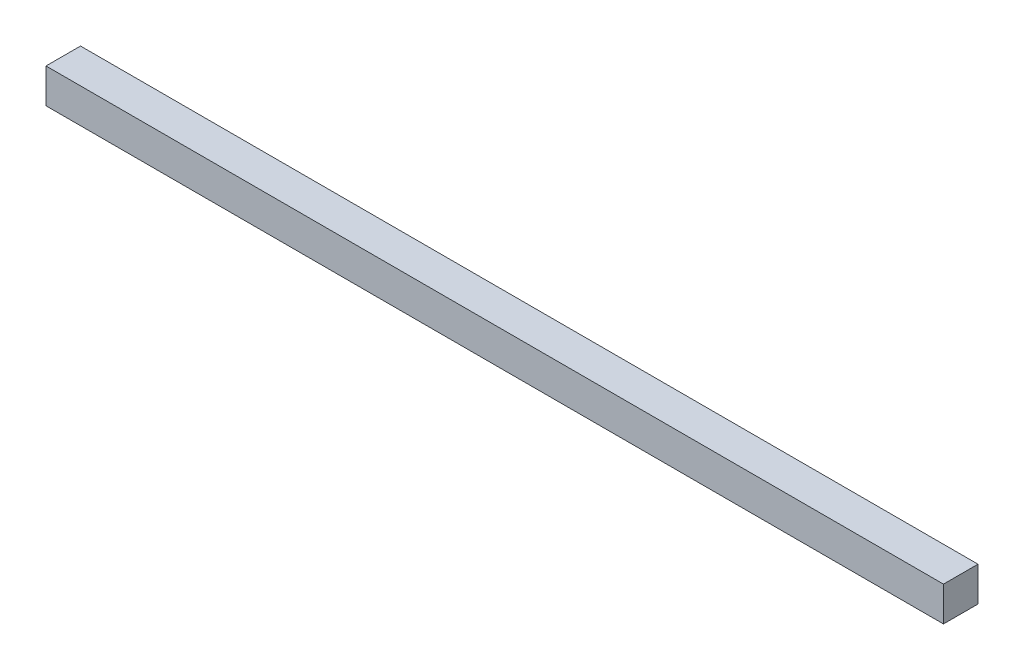
ISO-10303-21;
HEADER;
FILE_DESCRIPTION(('STEP AP214'),'2;1');
FILE_NAME('part.step','',(''),(''),'','','');
FILE_SCHEMA(('AUTOMOTIVE_DESIGN { 1 0 10303 214 1 1 1 1 }'));
ENDSEC;
DATA;
#1=APPLICATION_CONTEXT('core data for automotive mechanical design processes');
#2=APPLICATION_PROTOCOL_DEFINITION('international standard','automotive_design',2000,#1);
#3=PRODUCT_CONTEXT('',#1,'mechanical');
#4=PRODUCT('Part','Part','',(#3));
#5=PRODUCT_RELATED_PRODUCT_CATEGORY('part','',(#4));
#6=PRODUCT_DEFINITION_FORMATION('','',#4);
#7=PRODUCT_DEFINITION_CONTEXT('part definition',#1,'design');
#8=PRODUCT_DEFINITION('design','',#6,#7);
#9=PRODUCT_DEFINITION_SHAPE('','',#8);
#10=(LENGTH_UNIT() NAMED_UNIT(*) SI_UNIT(.MILLI.,.METRE.));
#11=(NAMED_UNIT(*) PLANE_ANGLE_UNIT() SI_UNIT($,.RADIAN.));
#12=(NAMED_UNIT(*) SI_UNIT($,.STERADIAN.) SOLID_ANGLE_UNIT());
#13=UNCERTAINTY_MEASURE_WITH_UNIT(LENGTH_MEASURE(1.E-05),#10,'distance_accuracy_value','');
#14=(GEOMETRIC_REPRESENTATION_CONTEXT(3) GLOBAL_UNCERTAINTY_ASSIGNED_CONTEXT((#13)) GLOBAL_UNIT_ASSIGNED_CONTEXT((#10,
#11,#12)) REPRESENTATION_CONTEXT('',''));
#15=CARTESIAN_POINT('',(0.,0.,0.));
#16=DIRECTION('',(0.,0.,1.));
#17=DIRECTION('',(1.,0.,0.));
#18=AXIS2_PLACEMENT_3D('',#15,#16,#17);
#19=CARTESIAN_POINT('',(0.,25.,25.));
#20=DIRECTION('',(1.,0.,0.));
#21=DIRECTION('',(0.,0.,-1.));
#22=AXIS2_PLACEMENT_3D('',#19,#20,#21);
#23=PLANE('',#22);
#24=DIRECTION('',(0.,-1.,0.));
#25=VECTOR('',#24,1.);
#26=CARTESIAN_POINT('',(0.,25.,0.));
#27=LINE('',#26,#25);
#28=CARTESIAN_POINT('',(0.,25.,0.));
#29=VERTEX_POINT('',#28);
#30=CARTESIAN_POINT('',(0.,0.,0.));
#31=VERTEX_POINT('',#30);
#32=EDGE_CURVE('E102',#29,#31,#27,.T.);
#33=ORIENTED_EDGE('',*,*,#32,.T.);
#34=DIRECTION('',(0.,0.,-1.));
#35=VECTOR('',#34,1.);
#36=CARTESIAN_POINT('',(0.,0.,25.));
#37=LINE('',#36,#35);
#38=CARTESIAN_POINT('',(0.,0.,25.));
#39=VERTEX_POINT('',#38);
#40=EDGE_CURVE('E11',#39,#31,#37,.T.);
#41=ORIENTED_EDGE('',*,*,#40,.F.);
#42=DIRECTION('',(0.,-1.,0.));
#43=VECTOR('',#42,1.);
#44=CARTESIAN_POINT('',(0.,25.,25.));
#45=LINE('',#44,#43);
#46=CARTESIAN_POINT('',(0.,25.,25.));
#47=VERTEX_POINT('',#46);
#48=EDGE_CURVE('E90',#47,#39,#45,.T.);
#49=ORIENTED_EDGE('',*,*,#48,.F.);
#50=DIRECTION('',(0.,0.,-1.));
#51=VECTOR('',#50,1.);
#52=CARTESIAN_POINT('',(0.,25.,25.));
#53=LINE('',#52,#51);
#54=EDGE_CURVE('E98',#47,#29,#53,.T.);
#55=ORIENTED_EDGE('',*,*,#54,.T.);
#56=EDGE_LOOP('',(#33,#41,#49,#55));
#57=FACE_BOUND('',#56,.T.);
#58=ADVANCED_FACE('F39',(#57),#23,.F.);
#59=CARTESIAN_POINT('',(0.,0.,25.));
#60=DIRECTION('',(0.,1.,0.));
#61=DIRECTION('',(0.,0.,1.));
#62=AXIS2_PLACEMENT_3D('',#59,#60,#61);
#63=PLANE('',#62);
#64=DIRECTION('',(1.,0.,0.));
#65=VECTOR('',#64,1.);
#66=CARTESIAN_POINT('',(0.,0.,0.));
#67=LINE('',#66,#65);
#68=CARTESIAN_POINT('',(650.,0.,0.));
#69=VERTEX_POINT('',#68);
#70=EDGE_CURVE('E94',#31,#69,#67,.T.);
#71=ORIENTED_EDGE('',*,*,#70,.T.);
#72=DIRECTION('',(0.,0.,-1.));
#73=VECTOR('',#72,1.);
#74=CARTESIAN_POINT('',(650.,0.,25.));
#75=LINE('',#74,#73);
#76=CARTESIAN_POINT('',(650.,0.,25.));
#77=VERTEX_POINT('',#76);
#78=EDGE_CURVE('E47',#77,#69,#75,.T.);
#79=ORIENTED_EDGE('',*,*,#78,.F.);
#80=DIRECTION('',(1.,0.,0.));
#81=VECTOR('',#80,1.);
#82=CARTESIAN_POINT('',(0.,0.,25.));
#83=LINE('',#82,#81);
#84=EDGE_CURVE('E85',#39,#77,#83,.T.);
#85=ORIENTED_EDGE('',*,*,#84,.F.);
#86=ORIENTED_EDGE('',*,*,#40,.T.);
#87=EDGE_LOOP('',(#71,#79,#85,#86));
#88=FACE_BOUND('',#87,.T.);
#89=ADVANCED_FACE('F93',(#88),#63,.F.);
#90=CARTESIAN_POINT('',(650.,0.,25.));
#91=DIRECTION('',(-1.,0.,0.));
#92=DIRECTION('',(0.,0.,1.));
#93=AXIS2_PLACEMENT_3D('',#90,#91,#92);
#94=PLANE('',#93);
#95=DIRECTION('',(0.,1.,0.));
#96=VECTOR('',#95,1.);
#97=CARTESIAN_POINT('',(650.,0.,0.));
#98=LINE('',#97,#96);
#99=CARTESIAN_POINT('',(650.,25.,0.));
#100=VERTEX_POINT('',#99);
#101=EDGE_CURVE('E72',#69,#100,#98,.T.);
#102=ORIENTED_EDGE('',*,*,#101,.T.);
#103=DIRECTION('',(0.,0.,-1.));
#104=VECTOR('',#103,1.);
#105=CARTESIAN_POINT('',(650.,25.,25.));
#106=LINE('',#105,#104);
#107=CARTESIAN_POINT('',(650.,25.,25.));
#108=VERTEX_POINT('',#107);
#109=EDGE_CURVE('E95',#108,#100,#106,.T.);
#110=ORIENTED_EDGE('',*,*,#109,.F.);
#111=DIRECTION('',(0.,1.,0.));
#112=VECTOR('',#111,1.);
#113=CARTESIAN_POINT('',(650.,0.,25.));
#114=LINE('',#113,#112);
#115=EDGE_CURVE('E88',#77,#108,#114,.T.);
#116=ORIENTED_EDGE('',*,*,#115,.F.);
#117=ORIENTED_EDGE('',*,*,#78,.T.);
#118=EDGE_LOOP('',(#102,#110,#116,#117));
#119=FACE_BOUND('',#118,.T.);
#120=ADVANCED_FACE('F96',(#119),#94,.F.);
#121=CARTESIAN_POINT('',(650.,25.,25.));
#122=DIRECTION('',(0.,-1.,0.));
#123=DIRECTION('',(0.,0.,-1.));
#124=AXIS2_PLACEMENT_3D('',#121,#122,#123);
#125=PLANE('',#124);
#126=DIRECTION('',(-1.,0.,0.));
#127=VECTOR('',#126,1.);
#128=CARTESIAN_POINT('',(650.,25.,0.));
#129=LINE('',#128,#127);
#130=EDGE_CURVE('E78',#100,#29,#129,.T.);
#131=ORIENTED_EDGE('',*,*,#130,.T.);
#132=ORIENTED_EDGE('',*,*,#54,.F.);
#133=DIRECTION('',(-1.,0.,0.));
#134=VECTOR('',#133,1.);
#135=CARTESIAN_POINT('',(650.,25.,25.));
#136=LINE('',#135,#134);
#137=EDGE_CURVE('E55',#108,#47,#136,.T.);
#138=ORIENTED_EDGE('',*,*,#137,.F.);
#139=ORIENTED_EDGE('',*,*,#109,.T.);
#140=EDGE_LOOP('',(#131,#132,#138,#139));
#141=FACE_BOUND('',#140,.T.);
#142=ADVANCED_FACE('F109',(#141),#125,.F.);
#143=CARTESIAN_POINT('',(0.,0.,25.));
#144=DIRECTION('',(0.,0.,1.));
#145=DIRECTION('',(1.,0.,0.));
#146=AXIS2_PLACEMENT_3D('',#143,#144,#145);
#147=PLANE('',#146);
#148=ORIENTED_EDGE('',*,*,#48,.T.);
#149=ORIENTED_EDGE('',*,*,#84,.T.);
#150=ORIENTED_EDGE('',*,*,#115,.T.);
#151=ORIENTED_EDGE('',*,*,#137,.T.);
#152=EDGE_LOOP('',(#148,#149,#150,#151));
#153=FACE_BOUND('',#152,.T.);
#154=ADVANCED_FACE('F86',(#153),#147,.T.);
#155=CARTESIAN_POINT('',(0.,0.,0.));
#156=DIRECTION('',(0.,0.,1.));
#157=DIRECTION('',(1.,0.,0.));
#158=AXIS2_PLACEMENT_3D('',#155,#156,#157);
#159=PLANE('',#158);
#160=ORIENTED_EDGE('',*,*,#32,.F.);
#161=ORIENTED_EDGE('',*,*,#130,.F.);
#162=ORIENTED_EDGE('',*,*,#101,.F.);
#163=ORIENTED_EDGE('',*,*,#70,.F.);
#164=EDGE_LOOP('',(#160,#161,#162,#163));
#165=FACE_BOUND('',#164,.T.);
#166=ADVANCED_FACE('F112',(#165),#159,.F.);
#167=CLOSED_SHELL('',(#58,#89,#120,#142,#154,#166));
#168=MANIFOLD_SOLID_BREP('B2',#167);
#169=ADVANCED_BREP_SHAPE_REPRESENTATION('',(#18,#168),#14);
#170=SHAPE_DEFINITION_REPRESENTATION(#9,#169);
ENDSEC;
END-ISO-10303-21;
